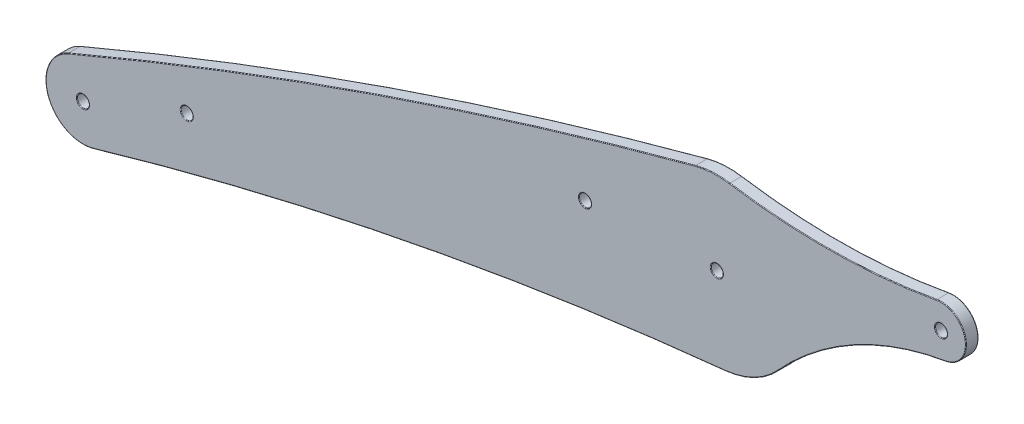
ISO-10303-21;
HEADER;
FILE_DESCRIPTION(('STEP AP214'),'2;1');
FILE_NAME('part.step','',(''),(''),'','','');
FILE_SCHEMA(('AUTOMOTIVE_DESIGN { 1 0 10303 214 1 1 1 1 }'));
ENDSEC;
DATA;
#1=APPLICATION_CONTEXT('core data for automotive mechanical design processes');
#2=APPLICATION_PROTOCOL_DEFINITION('international standard','automotive_design',2000,#1);
#3=PRODUCT_CONTEXT('',#1,'mechanical');
#4=PRODUCT('Part','Part','',(#3));
#5=PRODUCT_RELATED_PRODUCT_CATEGORY('part','',(#4));
#6=PRODUCT_DEFINITION_FORMATION('','',#4);
#7=PRODUCT_DEFINITION_CONTEXT('part definition',#1,'design');
#8=PRODUCT_DEFINITION('design','',#6,#7);
#9=PRODUCT_DEFINITION_SHAPE('','',#8);
#10=(LENGTH_UNIT() NAMED_UNIT(*) SI_UNIT(.MILLI.,.METRE.));
#11=(NAMED_UNIT(*) PLANE_ANGLE_UNIT() SI_UNIT($,.RADIAN.));
#12=(NAMED_UNIT(*) SI_UNIT($,.STERADIAN.) SOLID_ANGLE_UNIT());
#13=UNCERTAINTY_MEASURE_WITH_UNIT(LENGTH_MEASURE(1.E-05),#10,'distance_accuracy_value','');
#14=(GEOMETRIC_REPRESENTATION_CONTEXT(3) GLOBAL_UNCERTAINTY_ASSIGNED_CONTEXT((#13)) GLOBAL_UNIT_ASSIGNED_CONTEXT((#10,
#11,#12)) REPRESENTATION_CONTEXT('',''));
#15=CARTESIAN_POINT('',(0.,0.,0.));
#16=DIRECTION('',(0.,0.,1.));
#17=DIRECTION('',(1.,0.,0.));
#18=AXIS2_PLACEMENT_3D('',#15,#16,#17);
#19=CARTESIAN_POINT('',(-219.896078152354,156.899093699463,-3.));
#20=DIRECTION('',(0.,0.,1.));
#21=DIRECTION('',(1.,0.,0.));
#22=AXIS2_PLACEMENT_3D('',#19,#20,#21);
#23=CYLINDRICAL_SURFACE('',#22,9.00000000000002);
#24=DIRECTION('',(0.,0.,1.));
#25=VECTOR('',#24,1.);
#26=CARTESIAN_POINT('',(-223.412781063137,165.183585273319,-3.));
#27=LINE('',#26,#25);
#28=CARTESIAN_POINT('',(-223.412781063137,165.183585273319,-2.85));
#29=VERTEX_POINT('',#28);
#30=CARTESIAN_POINT('',(-223.412781063137,165.183585273319,-0.15));
#31=VERTEX_POINT('',#30);
#32=EDGE_CURVE('E152',#29,#31,#27,.T.);
#33=ORIENTED_EDGE('',*,*,#32,.F.);
#34=CARTESIAN_POINT('',(-219.896078152354,156.899093699463,-2.85));
#35=DIRECTION('',(0.,0.,1.));
#36=DIRECTION('',(1.,0.,0.));
#37=AXIS2_PLACEMENT_3D('',#34,#35,#36);
#38=CIRCLE('',#37,9.00000000000002);
#39=CARTESIAN_POINT('',(-217.370309700042,148.26077825458,-2.85));
#40=VERTEX_POINT('',#39);
#41=EDGE_CURVE('E147',#29,#40,#38,.T.);
#42=ORIENTED_EDGE('',*,*,#41,.T.);
#43=DIRECTION('',(0.,0.,1.));
#44=VECTOR('',#43,1.);
#45=CARTESIAN_POINT('',(-217.370309700042,148.26077825458,-3.));
#46=LINE('',#45,#44);
#47=CARTESIAN_POINT('',(-217.370309700042,148.26077825458,-0.15));
#48=VERTEX_POINT('',#47);
#49=EDGE_CURVE('E149',#40,#48,#46,.T.);
#50=ORIENTED_EDGE('',*,*,#49,.T.);
#51=CARTESIAN_POINT('',(-219.896078152354,156.899093699463,-0.15));
#52=DIRECTION('',(0.,0.,1.));
#53=DIRECTION('',(1.,0.,0.));
#54=AXIS2_PLACEMENT_3D('',#51,#52,#53);
#55=CIRCLE('',#54,9.00000000000002);
#56=EDGE_CURVE('E158',#48,#31,#55,.F.);
#57=ORIENTED_EDGE('',*,*,#56,.T.);
#58=EDGE_LOOP('',(#33,#42,#50,#57));
#59=FACE_BOUND('',#58,.T.);
#60=ADVANCED_FACE('F33',(#59),#23,.T.);
#61=CARTESIAN_POINT('',(225.943701981326,-893.390338052734,-3.));
#62=DIRECTION('',(0.,0.,1.));
#63=DIRECTION('',(1.,0.,0.));
#64=AXIS2_PLACEMENT_3D('',#61,#62,#63);
#65=CYLINDRICAL_SURFACE('',#64,1150.);
#66=DIRECTION('',(0.,0.,1.));
#67=VECTOR('',#66,1.);
#68=CARTESIAN_POINT('',(-72.4140554222163,217.232301999741,-3.));
#69=LINE('',#68,#67);
#70=CARTESIAN_POINT('',(-72.4140554222163,217.232301999741,-2.85));
#71=VERTEX_POINT('',#70);
#72=CARTESIAN_POINT('',(-72.4140554222163,217.232301999741,-0.15));
#73=VERTEX_POINT('',#72);
#74=EDGE_CURVE('E369',#71,#73,#69,.T.);
#75=ORIENTED_EDGE('',*,*,#74,.F.);
#76=CARTESIAN_POINT('',(225.943701981326,-893.390338052734,-2.85));
#77=DIRECTION('',(0.,0.,1.));
#78=DIRECTION('',(1.,0.,0.));
#79=AXIS2_PLACEMENT_3D('',#76,#77,#78);
#80=CIRCLE('',#79,1150.);
#81=EDGE_CURVE('E241',#71,#29,#80,.T.);
#82=ORIENTED_EDGE('',*,*,#81,.T.);
#83=ORIENTED_EDGE('',*,*,#32,.T.);
#84=CARTESIAN_POINT('',(225.943701981326,-893.390338052734,-0.15));
#85=DIRECTION('',(0.,0.,1.));
#86=DIRECTION('',(1.,0.,0.));
#87=AXIS2_PLACEMENT_3D('',#84,#85,#86);
#88=CIRCLE('',#87,1150.);
#89=EDGE_CURVE('E238',#31,#73,#88,.F.);
#90=ORIENTED_EDGE('',*,*,#89,.T.);
#91=EDGE_LOOP('',(#75,#82,#83,#90));
#92=FACE_BOUND('',#91,.T.);
#93=ADVANCED_FACE('F375',(#92),#65,.T.);
#94=CARTESIAN_POINT('',(-67.2252248586763,197.917125651003,-3.));
#95=DIRECTION('',(0.,0.,1.));
#96=DIRECTION('',(1.,0.,0.));
#97=AXIS2_PLACEMENT_3D('',#94,#95,#96);
#98=CYLINDRICAL_SURFACE('',#97,20.);
#99=DIRECTION('',(0.,0.,1.));
#100=VECTOR('',#99,1.);
#101=CARTESIAN_POINT('',(-64.1575992638607,217.680467301898,-3.));
#102=LINE('',#101,#100);
#103=CARTESIAN_POINT('',(-64.1575992638607,217.680467301898,-2.85));
#104=VERTEX_POINT('',#103);
#105=CARTESIAN_POINT('',(-64.1575992638607,217.680467301898,-0.15));
#106=VERTEX_POINT('',#105);
#107=EDGE_CURVE('E366',#104,#106,#102,.T.);
#108=ORIENTED_EDGE('',*,*,#107,.F.);
#109=CARTESIAN_POINT('',(-67.2252248586763,197.917125651003,-2.85));
#110=DIRECTION('',(0.,0.,1.));
#111=DIRECTION('',(1.,0.,0.));
#112=AXIS2_PLACEMENT_3D('',#109,#110,#111);
#113=CIRCLE('',#112,20.);
#114=EDGE_CURVE('E236',#104,#71,#113,.T.);
#115=ORIENTED_EDGE('',*,*,#114,.T.);
#116=ORIENTED_EDGE('',*,*,#74,.T.);
#117=CARTESIAN_POINT('',(-67.2252248586763,197.917125651003,-0.15));
#118=DIRECTION('',(0.,0.,1.));
#119=DIRECTION('',(1.,0.,0.));
#120=AXIS2_PLACEMENT_3D('',#117,#118,#119);
#121=CIRCLE('',#120,20.);
#122=EDGE_CURVE('E234',#73,#106,#121,.F.);
#123=ORIENTED_EDGE('',*,*,#122,.T.);
#124=EDGE_LOOP('',(#108,#115,#116,#123));
#125=FACE_BOUND('',#124,.T.);
#126=ADVANCED_FACE('F429',(#125),#98,.T.);
#127=CARTESIAN_POINT('',(-41.1504073027438,365.905529683617,-3.));
#128=DIRECTION('',(0.,0.,1.));
#129=DIRECTION('',(1.,0.,0.));
#130=AXIS2_PLACEMENT_3D('',#127,#128,#129);
#131=CYLINDRICAL_SURFACE('',#130,150.);
#132=DIRECTION('',(0.,0.,1.));
#133=VECTOR('',#132,1.);
#134=CARTESIAN_POINT('',(-14.2992703372944,218.328375477206,-3.));
#135=LINE('',#134,#133);
#136=CARTESIAN_POINT('',(-14.2992703372944,218.328375477206,-2.85));
#137=VERTEX_POINT('',#136);
#138=CARTESIAN_POINT('',(-14.2992703372944,218.328375477206,-0.15));
#139=VERTEX_POINT('',#138);
#140=EDGE_CURVE('E360',#137,#139,#135,.T.);
#141=ORIENTED_EDGE('',*,*,#140,.F.);
#142=CARTESIAN_POINT('',(-41.1504073027438,365.905529683617,-2.85));
#143=DIRECTION('',(0.,0.,1.));
#144=DIRECTION('',(1.,0.,0.));
#145=AXIS2_PLACEMENT_3D('',#142,#143,#144);
#146=CIRCLE('',#145,150.);
#147=EDGE_CURVE('E232',#137,#104,#146,.F.);
#148=ORIENTED_EDGE('',*,*,#147,.T.);
#149=ORIENTED_EDGE('',*,*,#107,.T.);
#150=CARTESIAN_POINT('',(-41.1504073027438,365.905529683617,-0.15));
#151=DIRECTION('',(0.,0.,1.));
#152=DIRECTION('',(1.,0.,0.));
#153=AXIS2_PLACEMENT_3D('',#150,#151,#152);
#154=CIRCLE('',#153,150.);
#155=EDGE_CURVE('E230',#106,#139,#154,.T.);
#156=ORIENTED_EDGE('',*,*,#155,.T.);
#157=EDGE_LOOP('',(#141,#148,#149,#156));
#158=FACE_BOUND('',#157,.T.);
#159=ADVANCED_FACE('F722',(#158),#131,.F.);
#160=CARTESIAN_POINT('',(-13.2252248586763,212.42528930895,-3.));
#161=DIRECTION('',(0.,0.,1.));
#162=DIRECTION('',(1.,0.,0.));
#163=AXIS2_PLACEMENT_3D('',#160,#161,#162);
#164=CYLINDRICAL_SURFACE('',#163,6.00000000000003);
#165=DIRECTION('',(0.,0.,1.));
#166=VECTOR('',#165,1.);
#167=CARTESIAN_POINT('',(-12.2224909899665,206.509672283775,-3.));
#168=LINE('',#167,#166);
#169=CARTESIAN_POINT('',(-12.2224909899665,206.509672283775,-2.85));
#170=VERTEX_POINT('',#169);
#171=CARTESIAN_POINT('',(-12.2224909899665,206.509672283775,-0.15));
#172=VERTEX_POINT('',#171);
#173=EDGE_CURVE('E356',#170,#172,#168,.T.);
#174=ORIENTED_EDGE('',*,*,#173,.F.);
#175=CARTESIAN_POINT('',(-13.2252248586763,212.42528930895,-2.85));
#176=DIRECTION('',(0.,0.,1.));
#177=DIRECTION('',(1.,0.,0.));
#178=AXIS2_PLACEMENT_3D('',#175,#176,#177);
#179=CIRCLE('',#178,6.00000000000003);
#180=EDGE_CURVE('E228',#170,#137,#179,.T.);
#181=ORIENTED_EDGE('',*,*,#180,.T.);
#182=ORIENTED_EDGE('',*,*,#140,.T.);
#183=CARTESIAN_POINT('',(-13.2252248586763,212.42528930895,-0.15));
#184=DIRECTION('',(0.,0.,1.));
#185=DIRECTION('',(1.,0.,0.));
#186=AXIS2_PLACEMENT_3D('',#183,#184,#185);
#187=CIRCLE('',#186,6.00000000000003);
#188=EDGE_CURVE('E226',#139,#172,#187,.F.);
#189=ORIENTED_EDGE('',*,*,#188,.T.);
#190=EDGE_LOOP('',(#174,#181,#182,#189));
#191=FACE_BOUND('',#190,.T.);
#192=ADVANCED_FACE('F714',(#191),#164,.T.);
#193=CARTESIAN_POINT('',(-0.523929188351785,137.494140323398,-3.));
#194=DIRECTION('',(0.,0.,1.));
#195=DIRECTION('',(1.,0.,0.));
#196=AXIS2_PLACEMENT_3D('',#193,#194,#195);
#197=CYLINDRICAL_SURFACE('',#196,70.);
#198=DIRECTION('',(0.,0.,1.));
#199=VECTOR('',#198,1.);
#200=CARTESIAN_POINT('',(-52.4027147097153,184.489795578201,-3.));
#201=LINE('',#200,#199);
#202=CARTESIAN_POINT('',(-52.4027147097153,184.489795578201,-2.85));
#203=VERTEX_POINT('',#202);
#204=CARTESIAN_POINT('',(-52.4027147097153,184.489795578201,-0.15));
#205=VERTEX_POINT('',#204);
#206=EDGE_CURVE('E353',#203,#205,#201,.T.);
#207=ORIENTED_EDGE('',*,*,#206,.F.);
#208=CARTESIAN_POINT('',(-0.523929188351785,137.494140323398,-2.85));
#209=DIRECTION('',(0.,0.,1.));
#210=DIRECTION('',(1.,0.,0.));
#211=AXIS2_PLACEMENT_3D('',#208,#209,#210);
#212=CIRCLE('',#211,70.);
#213=EDGE_CURVE('E224',#203,#170,#212,.F.);
#214=ORIENTED_EDGE('',*,*,#213,.T.);
#215=ORIENTED_EDGE('',*,*,#173,.T.);
#216=CARTESIAN_POINT('',(-0.523929188351785,137.494140323398,-0.15));
#217=DIRECTION('',(0.,0.,1.));
#218=DIRECTION('',(1.,0.,0.));
#219=AXIS2_PLACEMENT_3D('',#216,#217,#218);
#220=CIRCLE('',#219,70.);
#221=EDGE_CURVE('E222',#172,#205,#220,.T.);
#222=ORIENTED_EDGE('',*,*,#221,.T.);
#223=EDGE_LOOP('',(#207,#214,#215,#222));
#224=FACE_BOUND('',#223,.T.);
#225=ADVANCED_FACE('F352',(#224),#197,.F.);
#226=CARTESIAN_POINT('',(-67.2252248586763,197.917125651003,-3.));
#227=DIRECTION('',(0.,0.,1.));
#228=DIRECTION('',(1.,0.,0.));
#229=AXIS2_PLACEMENT_3D('',#226,#227,#228);
#230=CYLINDRICAL_SURFACE('',#229,20.);
#231=DIRECTION('',(0.,0.,1.));
#232=VECTOR('',#231,1.);
#233=CARTESIAN_POINT('',(-65.1930475383863,178.020637133204,-3.));
#234=LINE('',#233,#232);
#235=CARTESIAN_POINT('',(-65.1930475383863,178.020637133204,-2.85));
#236=VERTEX_POINT('',#235);
#237=CARTESIAN_POINT('',(-65.1930475383863,178.020637133204,-0.15));
#238=VERTEX_POINT('',#237);
#239=EDGE_CURVE('E169',#236,#238,#234,.T.);
#240=ORIENTED_EDGE('',*,*,#239,.F.);
#241=CARTESIAN_POINT('',(-67.2252248586763,197.917125651003,-2.85));
#242=DIRECTION('',(0.,0.,1.));
#243=DIRECTION('',(1.,0.,0.));
#244=AXIS2_PLACEMENT_3D('',#241,#242,#243);
#245=CIRCLE('',#244,20.);
#246=EDGE_CURVE('E220',#236,#203,#245,.T.);
#247=ORIENTED_EDGE('',*,*,#246,.T.);
#248=ORIENTED_EDGE('',*,*,#206,.T.);
#249=CARTESIAN_POINT('',(-67.2252248586763,197.917125651003,-0.15));
#250=DIRECTION('',(0.,0.,1.));
#251=DIRECTION('',(1.,0.,0.));
#252=AXIS2_PLACEMENT_3D('',#249,#250,#251);
#253=CIRCLE('',#252,20.);
#254=EDGE_CURVE('E218',#205,#238,#253,.F.);
#255=ORIENTED_EDGE('',*,*,#254,.T.);
#256=EDGE_LOOP('',(#240,#247,#248,#255));
#257=FACE_BOUND('',#256,.T.);
#258=ADVANCED_FACE('F358',(#257),#230,.T.);
#259=CARTESIAN_POINT('',(21.1744885739426,-667.580124873244,-3.));
#260=DIRECTION('',(0.,0.,1.));
#261=DIRECTION('',(1.,0.,0.));
#262=AXIS2_PLACEMENT_3D('',#259,#260,#261);
#263=CYLINDRICAL_SURFACE('',#262,850.);
#264=ORIENTED_EDGE('',*,*,#49,.F.);
#265=CARTESIAN_POINT('',(21.1744885739426,-667.580124873244,-2.85));
#266=DIRECTION('',(0.,0.,1.));
#267=DIRECTION('',(1.,0.,0.));
#268=AXIS2_PLACEMENT_3D('',#265,#266,#267);
#269=CIRCLE('',#268,850.);
#270=EDGE_CURVE('E165',#40,#236,#269,.F.);
#271=ORIENTED_EDGE('',*,*,#270,.T.);
#272=ORIENTED_EDGE('',*,*,#239,.T.);
#273=CARTESIAN_POINT('',(21.1744885739426,-667.580124873244,-0.15));
#274=DIRECTION('',(0.,0.,1.));
#275=DIRECTION('',(1.,0.,0.));
#276=AXIS2_PLACEMENT_3D('',#273,#274,#275);
#277=CIRCLE('',#276,850.);
#278=EDGE_CURVE('E168',#238,#48,#277,.T.);
#279=ORIENTED_EDGE('',*,*,#278,.T.);
#280=EDGE_LOOP('',(#264,#271,#272,#279));
#281=FACE_BOUND('',#280,.T.);
#282=ADVANCED_FACE('F162',(#281),#263,.F.);
#283=CARTESIAN_POINT('',(-99.3607947892059,-255.340515586891,-3.));
#284=DIRECTION('',(0.,0.,1.));
#285=DIRECTION('',(1.,0.,0.));
#286=AXIS2_PLACEMENT_3D('',#283,#284,#285);
#287=PLANE('',#286);
#288=CARTESIAN_POINT('',(-67.2252248586763,197.917125651003,-3.));
#289=DIRECTION('',(0.,0.,1.));
#290=DIRECTION('',(1.,0.,0.));
#291=AXIS2_PLACEMENT_3D('',#288,#289,#290);
#292=CIRCLE('',#291,19.85);
#293=CARTESIAN_POINT('',(-52.5138835358325,184.590500553747,-3.));
#294=VERTEX_POINT('',#293);
#295=CARTESIAN_POINT('',(-65.2082888682884,178.169860797087,-3.));
#296=VERTEX_POINT('',#295);
#297=EDGE_CURVE('E214',#294,#296,#292,.F.);
#298=ORIENTED_EDGE('',*,*,#297,.T.);
#299=CARTESIAN_POINT('',(21.1744885739426,-667.580124873244,-3.));
#300=DIRECTION('',(0.,0.,1.));
#301=DIRECTION('',(1.,0.,0.));
#302=AXIS2_PLACEMENT_3D('',#299,#300,#301);
#303=CIRCLE('',#302,850.15);
#304=CARTESIAN_POINT('',(-217.412405840913,148.404750178662,-3.));
#305=VERTEX_POINT('',#304);
#306=EDGE_CURVE('E216',#296,#305,#303,.T.);
#307=ORIENTED_EDGE('',*,*,#306,.T.);
#308=CARTESIAN_POINT('',(-219.896078152354,156.899093699463,-3.));
#309=DIRECTION('',(0.,0.,1.));
#310=DIRECTION('',(1.,0.,0.));
#311=AXIS2_PLACEMENT_3D('',#308,#309,#310);
#312=CIRCLE('',#311,8.85000000000002);
#313=CARTESIAN_POINT('',(-223.354169347957,165.045510413755,-3.));
#314=VERTEX_POINT('',#313);
#315=EDGE_CURVE('E175',#305,#314,#312,.F.);
#316=ORIENTED_EDGE('',*,*,#315,.T.);
#317=CARTESIAN_POINT('',(225.943701981326,-893.390338052734,-3.));
#318=DIRECTION('',(0.,0.,1.));
#319=DIRECTION('',(1.,0.,0.));
#320=AXIS2_PLACEMENT_3D('',#317,#318,#319);
#321=CIRCLE('',#320,1149.85);
#322=CARTESIAN_POINT('',(-72.3751391929897,217.087438177126,-3.));
#323=VERTEX_POINT('',#322);
#324=EDGE_CURVE('E204',#314,#323,#321,.F.);
#325=ORIENTED_EDGE('',*,*,#324,.T.);
#326=CARTESIAN_POINT('',(-67.2252248586763,197.917125651003,-3.));
#327=DIRECTION('',(0.,0.,1.));
#328=DIRECTION('',(1.,0.,0.));
#329=AXIS2_PLACEMENT_3D('',#326,#327,#328);
#330=CIRCLE('',#329,19.85);
#331=CARTESIAN_POINT('',(-64.1806064558219,217.532242239517,-3.));
#332=VERTEX_POINT('',#331);
#333=EDGE_CURVE('E206',#323,#332,#330,.F.);
#334=ORIENTED_EDGE('',*,*,#333,.T.);
#335=CARTESIAN_POINT('',(-41.1504073027438,365.905529683617,-3.));
#336=DIRECTION('',(0.,0.,1.));
#337=DIRECTION('',(1.,0.,0.));
#338=AXIS2_PLACEMENT_3D('',#335,#336,#337);
#339=CIRCLE('',#338,150.15);
#340=CARTESIAN_POINT('',(-14.2724192003289,218.180798323,-3.));
#341=VERTEX_POINT('',#340);
#342=EDGE_CURVE('E208',#332,#341,#339,.T.);
#343=ORIENTED_EDGE('',*,*,#342,.T.);
#344=CARTESIAN_POINT('',(-13.2252248586763,212.42528930895,-3.));
#345=DIRECTION('',(0.,0.,1.));
#346=DIRECTION('',(1.,0.,0.));
#347=AXIS2_PLACEMENT_3D('',#344,#345,#346);
#348=CIRCLE('',#347,5.85000000000003);
#349=CARTESIAN_POINT('',(-12.2475593366842,206.657562709404,-3.));
#350=VERTEX_POINT('',#349);
#351=EDGE_CURVE('E210',#341,#350,#348,.F.);
#352=ORIENTED_EDGE('',*,*,#351,.T.);
#353=CARTESIAN_POINT('',(-0.523929188351785,137.494140323398,-3.));
#354=DIRECTION('',(0.,0.,1.));
#355=DIRECTION('',(1.,0.,0.));
#356=AXIS2_PLACEMENT_3D('',#353,#354,#355);
#357=CIRCLE('',#356,70.15);
#358=EDGE_CURVE('E212',#350,#294,#357,.T.);
#359=ORIENTED_EDGE('',*,*,#358,.T.);
#360=EDGE_LOOP('',(#298,#307,#316,#325,#334,#343,#352,#359));
#361=FACE_BOUND('',#360,.T.);
#362=CARTESIAN_POINT('',(-13.2252248586763,212.42528930895,-3.));
#363=DIRECTION('',(0.,0.,1.));
#364=DIRECTION('',(1.,0.,0.));
#365=AXIS2_PLACEMENT_3D('',#362,#363,#364);
#366=CIRCLE('',#365,1.59999999999999);
#367=CARTESIAN_POINT('',(-11.6252248586763,212.42528930895,-3.));
#368=VERTEX_POINT('',#367);
#369=EDGE_CURVE('E200',#368,#368,#366,.T.);
#370=ORIENTED_EDGE('',*,*,#369,.T.);
#371=EDGE_LOOP('',(#370));
#372=FACE_BOUND('',#371,.T.);
#373=CARTESIAN_POINT('',(-67.2252248586763,197.917125651003,-3.));
#374=DIRECTION('',(0.,0.,1.));
#375=DIRECTION('',(1.,0.,0.));
#376=AXIS2_PLACEMENT_3D('',#373,#374,#375);
#377=CIRCLE('',#376,1.59999999999999);
#378=CARTESIAN_POINT('',(-65.6252248586763,197.917125651003,-3.));
#379=VERTEX_POINT('',#378);
#380=EDGE_CURVE('E197',#379,#379,#377,.T.);
#381=ORIENTED_EDGE('',*,*,#380,.T.);
#382=EDGE_LOOP('',(#381));
#383=FACE_BOUND('',#382,.T.);
#384=CARTESIAN_POINT('',(-98.9752248586763,196.66005329545,-3.));
#385=DIRECTION('',(0.,0.,1.));
#386=DIRECTION('',(1.,0.,0.));
#387=AXIS2_PLACEMENT_3D('',#384,#385,#386);
#388=CIRCLE('',#387,1.59999999999999);
#389=CARTESIAN_POINT('',(-97.3752248586763,196.66005329545,-3.));
#390=VERTEX_POINT('',#389);
#391=EDGE_CURVE('E194',#390,#390,#388,.T.);
#392=ORIENTED_EDGE('',*,*,#391,.T.);
#393=EDGE_LOOP('',(#392));
#394=FACE_BOUND('',#393,.T.);
#395=CARTESIAN_POINT('',(-194.896078152354,166.921661008845,-3.));
#396=DIRECTION('',(0.,0.,1.));
#397=DIRECTION('',(1.,0.,0.));
#398=AXIS2_PLACEMENT_3D('',#395,#396,#397);
#399=CIRCLE('',#398,1.59999999999998);
#400=CARTESIAN_POINT('',(-193.296078152354,166.921661008845,-3.));
#401=VERTEX_POINT('',#400);
#402=EDGE_CURVE('E188',#401,#401,#399,.T.);
#403=ORIENTED_EDGE('',*,*,#402,.T.);
#404=EDGE_LOOP('',(#403));
#405=FACE_BOUND('',#404,.T.);
#406=CARTESIAN_POINT('',(-219.896078152354,156.899093699463,-3.));
#407=DIRECTION('',(0.,0.,1.));
#408=DIRECTION('',(1.,0.,0.));
#409=AXIS2_PLACEMENT_3D('',#406,#407,#408);
#410=CIRCLE('',#409,1.59999999999998);
#411=CARTESIAN_POINT('',(-218.296078152354,156.899093699463,-3.));
#412=VERTEX_POINT('',#411);
#413=EDGE_CURVE('E185',#412,#412,#410,.T.);
#414=ORIENTED_EDGE('',*,*,#413,.T.);
#415=EDGE_LOOP('',(#414));
#416=FACE_BOUND('',#415,.T.);
#417=ADVANCED_FACE('F391',(#361,#372,#383,#394,#405,#416),#287,.F.);
#418=CARTESIAN_POINT('',(-99.3607947892059,-255.340515586891,0.));
#419=DIRECTION('',(0.,0.,1.));
#420=DIRECTION('',(1.,0.,0.));
#421=AXIS2_PLACEMENT_3D('',#418,#419,#420);
#422=PLANE('',#421);
#423=CARTESIAN_POINT('',(-67.2252248586763,197.917125651003,0.));
#424=DIRECTION('',(0.,0.,1.));
#425=DIRECTION('',(1.,0.,0.));
#426=AXIS2_PLACEMENT_3D('',#423,#424,#425);
#427=CIRCLE('',#426,19.85);
#428=CARTESIAN_POINT('',(-64.1806064558219,217.532242239517,0.));
#429=VERTEX_POINT('',#428);
#430=CARTESIAN_POINT('',(-72.3751391929897,217.087438177126,0.));
#431=VERTEX_POINT('',#430);
#432=EDGE_CURVE('E42',#429,#431,#427,.T.);
#433=ORIENTED_EDGE('',*,*,#432,.T.);
#434=CARTESIAN_POINT('',(225.943701981326,-893.390338052734,0.));
#435=DIRECTION('',(0.,0.,1.));
#436=DIRECTION('',(1.,0.,0.));
#437=AXIS2_PLACEMENT_3D('',#434,#435,#436);
#438=CIRCLE('',#437,1149.85);
#439=CARTESIAN_POINT('',(-223.354169347957,165.045510413755,0.));
#440=VERTEX_POINT('',#439);
#441=EDGE_CURVE('E11',#431,#440,#438,.T.);
#442=ORIENTED_EDGE('',*,*,#441,.T.);
#443=CARTESIAN_POINT('',(-219.896078152354,156.899093699463,0.));
#444=DIRECTION('',(0.,0.,1.));
#445=DIRECTION('',(1.,0.,0.));
#446=AXIS2_PLACEMENT_3D('',#443,#444,#445);
#447=CIRCLE('',#446,8.85000000000002);
#448=CARTESIAN_POINT('',(-217.412405840913,148.404750178662,0.));
#449=VERTEX_POINT('',#448);
#450=EDGE_CURVE('E288',#440,#449,#447,.T.);
#451=ORIENTED_EDGE('',*,*,#450,.T.);
#452=CARTESIAN_POINT('',(21.1744885739426,-667.580124873244,0.));
#453=DIRECTION('',(0.,0.,1.));
#454=DIRECTION('',(1.,0.,0.));
#455=AXIS2_PLACEMENT_3D('',#452,#453,#454);
#456=CIRCLE('',#455,850.15);
#457=CARTESIAN_POINT('',(-65.2082888682884,178.169860797087,0.));
#458=VERTEX_POINT('',#457);
#459=EDGE_CURVE('E290',#449,#458,#456,.F.);
#460=ORIENTED_EDGE('',*,*,#459,.T.);
#461=CARTESIAN_POINT('',(-67.2252248586763,197.917125651003,0.));
#462=DIRECTION('',(0.,0.,1.));
#463=DIRECTION('',(1.,0.,0.));
#464=AXIS2_PLACEMENT_3D('',#461,#462,#463);
#465=CIRCLE('',#464,19.85);
#466=CARTESIAN_POINT('',(-52.5138835358325,184.590500553747,0.));
#467=VERTEX_POINT('',#466);
#468=EDGE_CURVE('E292',#458,#467,#465,.T.);
#469=ORIENTED_EDGE('',*,*,#468,.T.);
#470=CARTESIAN_POINT('',(-0.523929188351785,137.494140323398,0.));
#471=DIRECTION('',(0.,0.,1.));
#472=DIRECTION('',(1.,0.,0.));
#473=AXIS2_PLACEMENT_3D('',#470,#471,#472);
#474=CIRCLE('',#473,70.15);
#475=CARTESIAN_POINT('',(-12.2475593366842,206.657562709404,0.));
#476=VERTEX_POINT('',#475);
#477=EDGE_CURVE('E294',#467,#476,#474,.F.);
#478=ORIENTED_EDGE('',*,*,#477,.T.);
#479=CARTESIAN_POINT('',(-13.2252248586763,212.42528930895,0.));
#480=DIRECTION('',(0.,0.,1.));
#481=DIRECTION('',(1.,0.,0.));
#482=AXIS2_PLACEMENT_3D('',#479,#480,#481);
#483=CIRCLE('',#482,5.85000000000003);
#484=CARTESIAN_POINT('',(-14.2724192003289,218.180798323,0.));
#485=VERTEX_POINT('',#484);
#486=EDGE_CURVE('E296',#476,#485,#483,.T.);
#487=ORIENTED_EDGE('',*,*,#486,.T.);
#488=CARTESIAN_POINT('',(-41.1504073027438,365.905529683617,0.));
#489=DIRECTION('',(0.,0.,1.));
#490=DIRECTION('',(1.,0.,0.));
#491=AXIS2_PLACEMENT_3D('',#488,#489,#490);
#492=CIRCLE('',#491,150.15);
#493=EDGE_CURVE('E53',#485,#429,#492,.F.);
#494=ORIENTED_EDGE('',*,*,#493,.T.);
#495=EDGE_LOOP('',(#433,#442,#451,#460,#469,#478,#487,#494));
#496=FACE_BOUND('',#495,.T.);
#497=CARTESIAN_POINT('',(-13.2252248586763,212.42528930895,0.));
#498=DIRECTION('',(0.,0.,1.));
#499=DIRECTION('',(1.,0.,0.));
#500=AXIS2_PLACEMENT_3D('',#497,#498,#499);
#501=CIRCLE('',#500,1.59999999999999);
#502=CARTESIAN_POINT('',(-11.6252248586763,212.42528930895,0.));
#503=VERTEX_POINT('',#502);
#504=EDGE_CURVE('E285',#503,#503,#501,.F.);
#505=ORIENTED_EDGE('',*,*,#504,.T.);
#506=EDGE_LOOP('',(#505));
#507=FACE_BOUND('',#506,.T.);
#508=CARTESIAN_POINT('',(-67.2252248586763,197.917125651003,0.));
#509=DIRECTION('',(0.,0.,1.));
#510=DIRECTION('',(1.,0.,0.));
#511=AXIS2_PLACEMENT_3D('',#508,#509,#510);
#512=CIRCLE('',#511,1.59999999999999);
#513=CARTESIAN_POINT('',(-65.6252248586763,197.917125651003,0.));
#514=VERTEX_POINT('',#513);
#515=EDGE_CURVE('E282',#514,#514,#512,.F.);
#516=ORIENTED_EDGE('',*,*,#515,.T.);
#517=EDGE_LOOP('',(#516));
#518=FACE_BOUND('',#517,.T.);
#519=CARTESIAN_POINT('',(-98.9752248586763,196.66005329545,0.));
#520=DIRECTION('',(0.,0.,1.));
#521=DIRECTION('',(1.,0.,0.));
#522=AXIS2_PLACEMENT_3D('',#519,#520,#521);
#523=CIRCLE('',#522,1.59999999999999);
#524=CARTESIAN_POINT('',(-97.3752248586763,196.66005329545,0.));
#525=VERTEX_POINT('',#524);
#526=EDGE_CURVE('E279',#525,#525,#523,.F.);
#527=ORIENTED_EDGE('',*,*,#526,.T.);
#528=EDGE_LOOP('',(#527));
#529=FACE_BOUND('',#528,.T.);
#530=CARTESIAN_POINT('',(-194.896078152354,166.921661008845,0.));
#531=DIRECTION('',(0.,0.,1.));
#532=DIRECTION('',(1.,0.,0.));
#533=AXIS2_PLACEMENT_3D('',#530,#531,#532);
#534=CIRCLE('',#533,1.59999999999998);
#535=CARTESIAN_POINT('',(-193.296078152354,166.921661008845,0.));
#536=VERTEX_POINT('',#535);
#537=EDGE_CURVE('E276',#536,#536,#534,.F.);
#538=ORIENTED_EDGE('',*,*,#537,.T.);
#539=EDGE_LOOP('',(#538));
#540=FACE_BOUND('',#539,.T.);
#541=CARTESIAN_POINT('',(-219.896078152354,156.899093699463,0.));
#542=DIRECTION('',(0.,0.,1.));
#543=DIRECTION('',(1.,0.,0.));
#544=AXIS2_PLACEMENT_3D('',#541,#542,#543);
#545=CIRCLE('',#544,1.59999999999998);
#546=CARTESIAN_POINT('',(-218.296078152354,156.899093699463,0.));
#547=VERTEX_POINT('',#546);
#548=EDGE_CURVE('E273',#547,#547,#545,.F.);
#549=ORIENTED_EDGE('',*,*,#548,.T.);
#550=EDGE_LOOP('',(#549));
#551=FACE_BOUND('',#550,.T.);
#552=ADVANCED_FACE('F387',(#496,#507,#518,#529,#540,#551),#422,.T.);
#553=CARTESIAN_POINT('',(-13.2252248586763,212.42528930895,0.));
#554=DIRECTION('',(0.,0.,1.));
#555=DIRECTION('',(1.,0.,0.));
#556=AXIS2_PLACEMENT_3D('',#553,#554,#555);
#557=CYLINDRICAL_SURFACE('',#556,1.44999999999999);
#558=CARTESIAN_POINT('',(-13.2252248586763,212.42528930895,-2.85));
#559=DIRECTION('',(0.,0.,1.));
#560=DIRECTION('',(1.,0.,0.));
#561=AXIS2_PLACEMENT_3D('',#558,#559,#560);
#562=CIRCLE('',#561,1.44999999999999);
#563=CARTESIAN_POINT('',(-11.7752248586763,212.42528930895,-2.85));
#564=VERTEX_POINT('',#563);
#565=EDGE_CURVE('E246',#564,#564,#562,.F.);
#566=ORIENTED_EDGE('',*,*,#565,.T.);
#567=EDGE_LOOP('',(#566));
#568=FACE_BOUND('',#567,.T.);
#569=CARTESIAN_POINT('',(-13.2252248586763,212.42528930895,-0.15));
#570=DIRECTION('',(0.,0.,1.));
#571=DIRECTION('',(1.,0.,0.));
#572=AXIS2_PLACEMENT_3D('',#569,#570,#571);
#573=CIRCLE('',#572,1.44999999999999);
#574=CARTESIAN_POINT('',(-11.7752248586763,212.42528930895,-0.15));
#575=VERTEX_POINT('',#574);
#576=EDGE_CURVE('E157',#575,#575,#573,.T.);
#577=ORIENTED_EDGE('',*,*,#576,.T.);
#578=EDGE_LOOP('',(#577));
#579=FACE_BOUND('',#578,.T.);
#580=ADVANCED_FACE('F390',(#568,#579),#557,.F.);
#581=CARTESIAN_POINT('',(-67.2252248586763,197.917125651003,0.));
#582=DIRECTION('',(0.,0.,1.));
#583=DIRECTION('',(1.,0.,0.));
#584=AXIS2_PLACEMENT_3D('',#581,#582,#583);
#585=CYLINDRICAL_SURFACE('',#584,1.44999999999999);
#586=CARTESIAN_POINT('',(-67.2252248586763,197.917125651003,-2.85));
#587=DIRECTION('',(0.,0.,1.));
#588=DIRECTION('',(1.,0.,0.));
#589=AXIS2_PLACEMENT_3D('',#586,#587,#588);
#590=CIRCLE('',#589,1.44999999999999);
#591=CARTESIAN_POINT('',(-65.7752248586763,197.917125651003,-2.85));
#592=VERTEX_POINT('',#591);
#593=EDGE_CURVE('E252',#592,#592,#590,.F.);
#594=ORIENTED_EDGE('',*,*,#593,.T.);
#595=EDGE_LOOP('',(#594));
#596=FACE_BOUND('',#595,.T.);
#597=CARTESIAN_POINT('',(-67.2252248586763,197.917125651003,-0.15));
#598=DIRECTION('',(0.,0.,1.));
#599=DIRECTION('',(1.,0.,0.));
#600=AXIS2_PLACEMENT_3D('',#597,#598,#599);
#601=CIRCLE('',#600,1.44999999999999);
#602=CARTESIAN_POINT('',(-65.7752248586763,197.917125651003,-0.15));
#603=VERTEX_POINT('',#602);
#604=EDGE_CURVE('E249',#603,#603,#601,.T.);
#605=ORIENTED_EDGE('',*,*,#604,.T.);
#606=EDGE_LOOP('',(#605));
#607=FACE_BOUND('',#606,.T.);
#608=ADVANCED_FACE('F664',(#596,#607),#585,.F.);
#609=CARTESIAN_POINT('',(-98.9752248586763,196.66005329545,0.));
#610=DIRECTION('',(0.,0.,1.));
#611=DIRECTION('',(1.,0.,0.));
#612=AXIS2_PLACEMENT_3D('',#609,#610,#611);
#613=CYLINDRICAL_SURFACE('',#612,1.44999999999999);
#614=CARTESIAN_POINT('',(-98.9752248586763,196.66005329545,-2.85));
#615=DIRECTION('',(0.,0.,1.));
#616=DIRECTION('',(1.,0.,0.));
#617=AXIS2_PLACEMENT_3D('',#614,#615,#616);
#618=CIRCLE('',#617,1.44999999999999);
#619=CARTESIAN_POINT('',(-97.5252248586763,196.66005329545,-2.85));
#620=VERTEX_POINT('',#619);
#621=EDGE_CURVE('E258',#620,#620,#618,.F.);
#622=ORIENTED_EDGE('',*,*,#621,.T.);
#623=EDGE_LOOP('',(#622));
#624=FACE_BOUND('',#623,.T.);
#625=CARTESIAN_POINT('',(-98.9752248586763,196.66005329545,-0.15));
#626=DIRECTION('',(0.,0.,1.));
#627=DIRECTION('',(1.,0.,0.));
#628=AXIS2_PLACEMENT_3D('',#625,#626,#627);
#629=CIRCLE('',#628,1.44999999999999);
#630=CARTESIAN_POINT('',(-97.5252248586763,196.66005329545,-0.15));
#631=VERTEX_POINT('',#630);
#632=EDGE_CURVE('E255',#631,#631,#629,.T.);
#633=ORIENTED_EDGE('',*,*,#632,.T.);
#634=EDGE_LOOP('',(#633));
#635=FACE_BOUND('',#634,.T.);
#636=ADVANCED_FACE('F421',(#624,#635),#613,.F.);
#637=CARTESIAN_POINT('',(-194.896078152354,166.921661008845,0.));
#638=DIRECTION('',(0.,0.,1.));
#639=DIRECTION('',(1.,0.,0.));
#640=AXIS2_PLACEMENT_3D('',#637,#638,#639);
#641=CYLINDRICAL_SURFACE('',#640,1.44999999999998);
#642=CARTESIAN_POINT('',(-194.896078152354,166.921661008845,-2.85));
#643=DIRECTION('',(0.,0.,1.));
#644=DIRECTION('',(1.,0.,0.));
#645=AXIS2_PLACEMENT_3D('',#642,#643,#644);
#646=CIRCLE('',#645,1.44999999999998);
#647=CARTESIAN_POINT('',(-193.446078152354,166.921661008845,-2.85));
#648=VERTEX_POINT('',#647);
#649=EDGE_CURVE('E264',#648,#648,#646,.F.);
#650=ORIENTED_EDGE('',*,*,#649,.T.);
#651=EDGE_LOOP('',(#650));
#652=FACE_BOUND('',#651,.T.);
#653=CARTESIAN_POINT('',(-194.896078152354,166.921661008845,-0.15));
#654=DIRECTION('',(0.,0.,1.));
#655=DIRECTION('',(1.,0.,0.));
#656=AXIS2_PLACEMENT_3D('',#653,#654,#655);
#657=CIRCLE('',#656,1.44999999999998);
#658=CARTESIAN_POINT('',(-193.446078152354,166.921661008845,-0.15));
#659=VERTEX_POINT('',#658);
#660=EDGE_CURVE('E261',#659,#659,#657,.T.);
#661=ORIENTED_EDGE('',*,*,#660,.T.);
#662=EDGE_LOOP('',(#661));
#663=FACE_BOUND('',#662,.T.);
#664=ADVANCED_FACE('F411',(#652,#663),#641,.F.);
#665=CARTESIAN_POINT('',(-219.896078152354,156.899093699463,0.));
#666=DIRECTION('',(0.,0.,1.));
#667=DIRECTION('',(1.,0.,0.));
#668=AXIS2_PLACEMENT_3D('',#665,#666,#667);
#669=CYLINDRICAL_SURFACE('',#668,1.44999999999998);
#670=CARTESIAN_POINT('',(-219.896078152354,156.899093699463,-2.85));
#671=DIRECTION('',(0.,0.,1.));
#672=DIRECTION('',(1.,0.,0.));
#673=AXIS2_PLACEMENT_3D('',#670,#671,#672);
#674=CIRCLE('',#673,1.44999999999998);
#675=CARTESIAN_POINT('',(-218.446078152354,156.899093699463,-2.85));
#676=VERTEX_POINT('',#675);
#677=EDGE_CURVE('E270',#676,#676,#674,.F.);
#678=ORIENTED_EDGE('',*,*,#677,.T.);
#679=EDGE_LOOP('',(#678));
#680=FACE_BOUND('',#679,.T.);
#681=CARTESIAN_POINT('',(-219.896078152354,156.899093699463,-0.15));
#682=DIRECTION('',(0.,0.,1.));
#683=DIRECTION('',(1.,0.,0.));
#684=AXIS2_PLACEMENT_3D('',#681,#682,#683);
#685=CIRCLE('',#684,1.44999999999998);
#686=CARTESIAN_POINT('',(-218.446078152354,156.899093699463,-0.15));
#687=VERTEX_POINT('',#686);
#688=EDGE_CURVE('E267',#687,#687,#685,.T.);
#689=ORIENTED_EDGE('',*,*,#688,.T.);
#690=EDGE_LOOP('',(#689));
#691=FACE_BOUND('',#690,.T.);
#692=ADVANCED_FACE('F408',(#680,#691),#669,.F.);
#693=CARTESIAN_POINT('',(-41.1504073027438,365.905529683617,-2.85));
#694=DIRECTION('',(0.,0.,1.));
#695=DIRECTION('',(1.,0.,0.));
#696=AXIS2_PLACEMENT_3D('',#693,#694,#695);
#697=TOROIDAL_SURFACE('',#696,150.15,0.15);
#698=CARTESIAN_POINT('',(-14.2724192003289,218.180798323,-2.85));
#699=DIRECTION('',(0.983847694709401,0.179007579769675,0.));
#700=DIRECTION('',(-0.179007579769675,0.983847694709401,0.));
#701=AXIS2_PLACEMENT_3D('',#698,#699,#700);
#702=CIRCLE('',#701,0.15);
#703=EDGE_CURVE('E311',#341,#137,#702,.T.);
#704=ORIENTED_EDGE('',*,*,#703,.F.);
#705=ORIENTED_EDGE('',*,*,#342,.F.);
#706=CARTESIAN_POINT('',(-64.1806064558219,217.532242239517,-2.85));
#707=DIRECTION('',(-0.988167082544786,0.153381279740799,0.));
#708=DIRECTION('',(-0.153381279740799,-0.988167082544786,0.));
#709=AXIS2_PLACEMENT_3D('',#706,#707,#708);
#710=CIRCLE('',#709,0.15);
#711=EDGE_CURVE('E170',#104,#332,#710,.T.);
#712=ORIENTED_EDGE('',*,*,#711,.F.);
#713=ORIENTED_EDGE('',*,*,#147,.F.);
#714=EDGE_LOOP('',(#704,#705,#712,#713));
#715=FACE_BOUND('',#714,.T.);
#716=ADVANCED_FACE('F410',(#715),#697,.T.);
#717=CARTESIAN_POINT('',(-67.2252248586763,197.917125651003,-2.85));
#718=DIRECTION('',(0.,0.,1.));
#719=DIRECTION('',(1.,0.,0.));
#720=AXIS2_PLACEMENT_3D('',#717,#718,#719);
#721=TOROIDAL_SURFACE('',#720,19.85,0.15);
#722=ORIENTED_EDGE('',*,*,#711,.T.);
#723=ORIENTED_EDGE('',*,*,#333,.F.);
#724=CARTESIAN_POINT('',(-72.3751391929897,217.087438177126,-2.85));
#725=DIRECTION('',(-0.965758817436919,-0.25944152817705,0.));
#726=DIRECTION('',(0.25944152817705,-0.965758817436919,0.));
#727=AXIS2_PLACEMENT_3D('',#724,#725,#726);
#728=CIRCLE('',#727,0.15);
#729=EDGE_CURVE('E308',#71,#323,#728,.T.);
#730=ORIENTED_EDGE('',*,*,#729,.F.);
#731=ORIENTED_EDGE('',*,*,#114,.F.);
#732=EDGE_LOOP('',(#722,#723,#730,#731));
#733=FACE_BOUND('',#732,.T.);
#734=ADVANCED_FACE('F418',(#733),#721,.T.);
#735=CARTESIAN_POINT('',(-13.2252248586763,212.42528930895,-2.85));
#736=DIRECTION('',(0.,0.,1.));
#737=DIRECTION('',(1.,0.,0.));
#738=AXIS2_PLACEMENT_3D('',#735,#736,#737);
#739=TOROIDAL_SURFACE('',#738,5.85000000000003,0.15);
#740=ORIENTED_EDGE('',*,*,#703,.T.);
#741=ORIENTED_EDGE('',*,*,#180,.F.);
#742=CARTESIAN_POINT('',(-12.2475593366842,206.657562709404,-2.85));
#743=DIRECTION('',(-0.985936170862524,-0.167122311451655,0.));
#744=DIRECTION('',(0.167122311451655,-0.985936170862524,0.));
#745=AXIS2_PLACEMENT_3D('',#742,#743,#744);
#746=CIRCLE('',#745,0.15);
#747=EDGE_CURVE('E305',#350,#170,#746,.T.);
#748=ORIENTED_EDGE('',*,*,#747,.F.);
#749=ORIENTED_EDGE('',*,*,#351,.F.);
#750=EDGE_LOOP('',(#740,#741,#748,#749));
#751=FACE_BOUND('',#750,.T.);
#752=ADVANCED_FACE('F450',(#751),#739,.T.);
#753=CARTESIAN_POINT('',(225.943701981326,-893.390338052734,-2.85));
#754=DIRECTION('',(0.,0.,1.));
#755=DIRECTION('',(1.,0.,0.));
#756=AXIS2_PLACEMENT_3D('',#753,#754,#755);
#757=TOROIDAL_SURFACE('',#756,1149.85,0.15);
#758=ORIENTED_EDGE('',*,*,#729,.T.);
#759=ORIENTED_EDGE('',*,*,#324,.F.);
#760=CARTESIAN_POINT('',(-223.354169347957,165.045510413755,-2.85));
#761=DIRECTION('',(-0.920499063761799,-0.390744767864717,0.));
#762=DIRECTION('',(0.390744767864717,-0.920499063761799,0.));
#763=AXIS2_PLACEMENT_3D('',#760,#761,#762);
#764=CIRCLE('',#763,0.15);
#765=EDGE_CURVE('E303',#29,#314,#764,.T.);
#766=ORIENTED_EDGE('',*,*,#765,.F.);
#767=ORIENTED_EDGE('',*,*,#81,.F.);
#768=EDGE_LOOP('',(#758,#759,#766,#767));
#769=FACE_BOUND('',#768,.T.);
#770=ADVANCED_FACE('F446',(#769),#757,.T.);
#771=CARTESIAN_POINT('',(-0.523929188351785,137.494140323398,-2.85));
#772=DIRECTION('',(0.,0.,1.));
#773=DIRECTION('',(1.,0.,0.));
#774=AXIS2_PLACEMENT_3D('',#771,#772,#773);
#775=TOROIDAL_SURFACE('',#774,70.15,0.15);
#776=ORIENTED_EDGE('',*,*,#747,.T.);
#777=ORIENTED_EDGE('',*,*,#213,.F.);
#778=CARTESIAN_POINT('',(-52.5138835358325,184.590500553747,-2.85));
#779=DIRECTION('',(-0.671366503640103,-0.741125507448006,0.));
#780=DIRECTION('',(0.741125507448006,-0.671366503640103,0.));
#781=AXIS2_PLACEMENT_3D('',#778,#779,#780);
#782=CIRCLE('',#781,0.15);
#783=EDGE_CURVE('E179',#294,#203,#782,.T.);
#784=ORIENTED_EDGE('',*,*,#783,.F.);
#785=ORIENTED_EDGE('',*,*,#358,.F.);
#786=EDGE_LOOP('',(#776,#777,#784,#785));
#787=FACE_BOUND('',#786,.T.);
#788=ADVANCED_FACE('F443',(#787),#775,.T.);
#789=CARTESIAN_POINT('',(-219.896078152354,156.899093699463,-2.85));
#790=DIRECTION('',(0.,0.,1.));
#791=DIRECTION('',(1.,0.,0.));
#792=AXIS2_PLACEMENT_3D('',#789,#790,#791);
#793=TOROIDAL_SURFACE('',#792,8.85000000000002,0.15);
#794=ORIENTED_EDGE('',*,*,#765,.T.);
#795=ORIENTED_EDGE('',*,*,#315,.F.);
#796=CARTESIAN_POINT('',(-217.412405840913,148.404750178662,-2.85));
#797=DIRECTION('',(0.959812827209192,0.280640939145909,1.77601050016369E-13));
#798=DIRECTION('',(-0.280640939145909,0.959812827209192,0.));
#799=AXIS2_PLACEMENT_3D('',#796,#797,#798);
#800=CIRCLE('',#799,0.15);
#801=EDGE_CURVE('E173',#40,#305,#800,.T.);
#802=ORIENTED_EDGE('',*,*,#801,.F.);
#803=ORIENTED_EDGE('',*,*,#41,.F.);
#804=EDGE_LOOP('',(#794,#795,#802,#803));
#805=FACE_BOUND('',#804,.T.);
#806=ADVANCED_FACE('F174',(#805),#793,.T.);
#807=CARTESIAN_POINT('',(-67.2252248586763,197.917125651003,-2.85));
#808=DIRECTION('',(0.,0.,1.));
#809=DIRECTION('',(1.,0.,0.));
#810=AXIS2_PLACEMENT_3D('',#807,#808,#809);
#811=TOROIDAL_SURFACE('',#810,19.85,0.15);
#812=ORIENTED_EDGE('',*,*,#783,.T.);
#813=ORIENTED_EDGE('',*,*,#246,.F.);
#814=CARTESIAN_POINT('',(-65.2082888682884,178.169860797087,-2.85));
#815=DIRECTION('',(-0.994824425889939,-0.101608866014502,0.));
#816=DIRECTION('',(0.101608866014502,-0.994824425889939,0.));
#817=AXIS2_PLACEMENT_3D('',#814,#815,#816);
#818=CIRCLE('',#817,0.15);
#819=EDGE_CURVE('E180',#296,#236,#818,.T.);
#820=ORIENTED_EDGE('',*,*,#819,.F.);
#821=ORIENTED_EDGE('',*,*,#297,.F.);
#822=EDGE_LOOP('',(#812,#813,#820,#821));
#823=FACE_BOUND('',#822,.T.);
#824=ADVANCED_FACE('F437',(#823),#811,.T.);
#825=CARTESIAN_POINT('',(21.1744885739426,-667.580124873244,-2.85));
#826=DIRECTION('',(0.,0.,1.));
#827=DIRECTION('',(1.,0.,0.));
#828=AXIS2_PLACEMENT_3D('',#825,#826,#827);
#829=TOROIDAL_SURFACE('',#828,850.15,0.15);
#830=ORIENTED_EDGE('',*,*,#801,.T.);
#831=ORIENTED_EDGE('',*,*,#306,.F.);
#832=ORIENTED_EDGE('',*,*,#819,.T.);
#833=ORIENTED_EDGE('',*,*,#270,.F.);
#834=EDGE_LOOP('',(#830,#831,#832,#833));
#835=FACE_BOUND('',#834,.T.);
#836=ADVANCED_FACE('F182',(#835),#829,.T.);
#837=CARTESIAN_POINT('',(-13.2252248586763,212.42528930895,-2.85));
#838=DIRECTION('',(0.,0.,1.));
#839=DIRECTION('',(1.,0.,0.));
#840=AXIS2_PLACEMENT_3D('',#837,#838,#839);
#841=TOROIDAL_SURFACE('',#840,1.59999999999999,0.15);
#842=ORIENTED_EDGE('',*,*,#565,.F.);
#843=EDGE_LOOP('',(#842));
#844=FACE_BOUND('',#843,.T.);
#845=ORIENTED_EDGE('',*,*,#369,.F.);
#846=EDGE_LOOP('',(#845));
#847=FACE_BOUND('',#846,.T.);
#848=ADVANCED_FACE('F436',(#844,#847),#841,.T.);
#849=CARTESIAN_POINT('',(-67.2252248586763,197.917125651003,-2.85));
#850=DIRECTION('',(0.,0.,1.));
#851=DIRECTION('',(1.,0.,0.));
#852=AXIS2_PLACEMENT_3D('',#849,#850,#851);
#853=TOROIDAL_SURFACE('',#852,1.59999999999999,0.15);
#854=ORIENTED_EDGE('',*,*,#593,.F.);
#855=EDGE_LOOP('',(#854));
#856=FACE_BOUND('',#855,.T.);
#857=ORIENTED_EDGE('',*,*,#380,.F.);
#858=EDGE_LOOP('',(#857));
#859=FACE_BOUND('',#858,.T.);
#860=ADVANCED_FACE('F460',(#856,#859),#853,.T.);
#861=CARTESIAN_POINT('',(-98.9752248586763,196.66005329545,-2.85));
#862=DIRECTION('',(0.,0.,1.));
#863=DIRECTION('',(1.,0.,0.));
#864=AXIS2_PLACEMENT_3D('',#861,#862,#863);
#865=TOROIDAL_SURFACE('',#864,1.59999999999999,0.15);
#866=ORIENTED_EDGE('',*,*,#621,.F.);
#867=EDGE_LOOP('',(#866));
#868=FACE_BOUND('',#867,.T.);
#869=ORIENTED_EDGE('',*,*,#391,.F.);
#870=EDGE_LOOP('',(#869));
#871=FACE_BOUND('',#870,.T.);
#872=ADVANCED_FACE('F464',(#868,#871),#865,.T.);
#873=CARTESIAN_POINT('',(-194.896078152354,166.921661008845,-2.85));
#874=DIRECTION('',(0.,0.,1.));
#875=DIRECTION('',(1.,0.,0.));
#876=AXIS2_PLACEMENT_3D('',#873,#874,#875);
#877=TOROIDAL_SURFACE('',#876,1.59999999999998,0.15);
#878=ORIENTED_EDGE('',*,*,#649,.F.);
#879=EDGE_LOOP('',(#878));
#880=FACE_BOUND('',#879,.T.);
#881=ORIENTED_EDGE('',*,*,#402,.F.);
#882=EDGE_LOOP('',(#881));
#883=FACE_BOUND('',#882,.T.);
#884=ADVANCED_FACE('F468',(#880,#883),#877,.T.);
#885=CARTESIAN_POINT('',(-219.896078152354,156.899093699463,-2.85));
#886=DIRECTION('',(0.,0.,1.));
#887=DIRECTION('',(1.,0.,0.));
#888=AXIS2_PLACEMENT_3D('',#885,#886,#887);
#889=TOROIDAL_SURFACE('',#888,1.59999999999998,0.15);
#890=ORIENTED_EDGE('',*,*,#677,.F.);
#891=EDGE_LOOP('',(#890));
#892=FACE_BOUND('',#891,.T.);
#893=ORIENTED_EDGE('',*,*,#413,.F.);
#894=EDGE_LOOP('',(#893));
#895=FACE_BOUND('',#894,.T.);
#896=ADVANCED_FACE('F472',(#892,#895),#889,.T.);
#897=CARTESIAN_POINT('',(-0.523929188351785,137.494140323398,-0.15));
#898=DIRECTION('',(0.,0.,1.));
#899=DIRECTION('',(1.,0.,0.));
#900=AXIS2_PLACEMENT_3D('',#897,#898,#899);
#901=TOROIDAL_SURFACE('',#900,70.15,0.15);
#902=CARTESIAN_POINT('',(-52.5138835358325,184.590500553747,-0.15));
#903=DIRECTION('',(-0.67136650364008,-0.741125507448027,0.));
#904=DIRECTION('',(0.741125507448027,-0.67136650364008,0.));
#905=AXIS2_PLACEMENT_3D('',#902,#903,#904);
#906=CIRCLE('',#905,0.15);
#907=EDGE_CURVE('E331',#205,#467,#906,.T.);
#908=ORIENTED_EDGE('',*,*,#907,.F.);
#909=ORIENTED_EDGE('',*,*,#221,.F.);
#910=CARTESIAN_POINT('',(-12.2475593366842,206.657562709404,-0.15));
#911=DIRECTION('',(0.985936170862524,0.167122311451655,0.));
#912=DIRECTION('',(-0.167122311451655,0.985936170862524,0.));
#913=AXIS2_PLACEMENT_3D('',#910,#911,#912);
#914=CIRCLE('',#913,0.15);
#915=EDGE_CURVE('E37',#476,#172,#914,.T.);
#916=ORIENTED_EDGE('',*,*,#915,.F.);
#917=ORIENTED_EDGE('',*,*,#477,.F.);
#918=EDGE_LOOP('',(#908,#909,#916,#917));
#919=FACE_BOUND('',#918,.T.);
#920=ADVANCED_FACE('F347',(#919),#901,.T.);
#921=CARTESIAN_POINT('',(-13.2252248586763,212.42528930895,-0.15));
#922=DIRECTION('',(0.,0.,1.));
#923=DIRECTION('',(1.,0.,0.));
#924=AXIS2_PLACEMENT_3D('',#921,#922,#923);
#925=TOROIDAL_SURFACE('',#924,5.85000000000003,0.15);
#926=ORIENTED_EDGE('',*,*,#915,.T.);
#927=ORIENTED_EDGE('',*,*,#188,.F.);
#928=CARTESIAN_POINT('',(-14.2724192003289,218.180798323,-0.15));
#929=DIRECTION('',(-0.983847694709403,-0.179007579769664,0.));
#930=DIRECTION('',(0.179007579769664,-0.983847694709404,0.));
#931=AXIS2_PLACEMENT_3D('',#928,#929,#930);
#932=CIRCLE('',#931,0.15);
#933=EDGE_CURVE('E329',#485,#139,#932,.T.);
#934=ORIENTED_EDGE('',*,*,#933,.F.);
#935=ORIENTED_EDGE('',*,*,#486,.F.);
#936=EDGE_LOOP('',(#926,#927,#934,#935));
#937=FACE_BOUND('',#936,.T.);
#938=ADVANCED_FACE('F342',(#937),#925,.T.);
#939=CARTESIAN_POINT('',(-67.2252248586763,197.917125651003,-0.15));
#940=DIRECTION('',(0.,0.,1.));
#941=DIRECTION('',(1.,0.,0.));
#942=AXIS2_PLACEMENT_3D('',#939,#940,#941);
#943=TOROIDAL_SURFACE('',#942,19.85,0.15);
#944=ORIENTED_EDGE('',*,*,#907,.T.);
#945=ORIENTED_EDGE('',*,*,#468,.F.);
#946=CARTESIAN_POINT('',(-65.2082888682884,178.169860797087,-0.15));
#947=DIRECTION('',(-0.994824425889939,-0.101608866014502,0.));
#948=DIRECTION('',(0.101608866014502,-0.994824425889939,0.));
#949=AXIS2_PLACEMENT_3D('',#946,#947,#948);
#950=CIRCLE('',#949,0.15);
#951=EDGE_CURVE('E326',#238,#458,#950,.T.);
#952=ORIENTED_EDGE('',*,*,#951,.F.);
#953=ORIENTED_EDGE('',*,*,#254,.F.);
#954=EDGE_LOOP('',(#944,#945,#952,#953));
#955=FACE_BOUND('',#954,.T.);
#956=ADVANCED_FACE('F493',(#955),#943,.T.);
#957=CARTESIAN_POINT('',(-41.1504073027438,365.905529683617,-0.15));
#958=DIRECTION('',(0.,0.,1.));
#959=DIRECTION('',(1.,0.,0.));
#960=AXIS2_PLACEMENT_3D('',#957,#958,#959);
#961=TOROIDAL_SURFACE('',#960,150.15,0.15);
#962=ORIENTED_EDGE('',*,*,#933,.T.);
#963=ORIENTED_EDGE('',*,*,#155,.F.);
#964=CARTESIAN_POINT('',(-64.1806064558219,217.532242239517,-0.15));
#965=DIRECTION('',(-0.988167082544791,0.153381279740771,0.));
#966=DIRECTION('',(-0.153381279740771,-0.988167082544791,0.));
#967=AXIS2_PLACEMENT_3D('',#964,#965,#966);
#968=CIRCLE('',#967,0.15);
#969=EDGE_CURVE('E323',#429,#106,#968,.T.);
#970=ORIENTED_EDGE('',*,*,#969,.F.);
#971=ORIENTED_EDGE('',*,*,#493,.F.);
#972=EDGE_LOOP('',(#962,#963,#970,#971));
#973=FACE_BOUND('',#972,.T.);
#974=ADVANCED_FACE('F489',(#973),#961,.T.);
#975=CARTESIAN_POINT('',(21.1744885739426,-667.580124873244,-0.15));
#976=DIRECTION('',(0.,0.,1.));
#977=DIRECTION('',(1.,0.,0.));
#978=AXIS2_PLACEMENT_3D('',#975,#976,#977);
#979=TOROIDAL_SURFACE('',#978,850.15,0.15);
#980=ORIENTED_EDGE('',*,*,#951,.T.);
#981=ORIENTED_EDGE('',*,*,#459,.F.);
#982=CARTESIAN_POINT('',(-217.412405840913,148.404750178662,-0.15));
#983=DIRECTION('',(-0.959812827209192,-0.280640939145909,0.));
#984=DIRECTION('',(0.280640939145909,-0.959812827209192,0.));
#985=AXIS2_PLACEMENT_3D('',#982,#983,#984);
#986=CIRCLE('',#985,0.15);
#987=EDGE_CURVE('E320',#48,#449,#986,.T.);
#988=ORIENTED_EDGE('',*,*,#987,.F.);
#989=ORIENTED_EDGE('',*,*,#278,.F.);
#990=EDGE_LOOP('',(#980,#981,#988,#989));
#991=FACE_BOUND('',#990,.T.);
#992=ADVANCED_FACE('F485',(#991),#979,.T.);
#993=CARTESIAN_POINT('',(-67.2252248586763,197.917125651003,-0.15));
#994=DIRECTION('',(0.,0.,1.));
#995=DIRECTION('',(1.,0.,0.));
#996=AXIS2_PLACEMENT_3D('',#993,#994,#995);
#997=TOROIDAL_SURFACE('',#996,19.85,0.15);
#998=ORIENTED_EDGE('',*,*,#969,.T.);
#999=ORIENTED_EDGE('',*,*,#122,.F.);
#1000=CARTESIAN_POINT('',(-72.3751391929897,217.087438177126,-0.15));
#1001=DIRECTION('',(-0.965758817436932,-0.259441528177003,0.));
#1002=DIRECTION('',(0.259441528177003,-0.965758817436932,0.));
#1003=AXIS2_PLACEMENT_3D('',#1000,#1001,#1002);
#1004=CIRCLE('',#1003,0.15);
#1005=EDGE_CURVE('E318',#431,#73,#1004,.T.);
#1006=ORIENTED_EDGE('',*,*,#1005,.F.);
#1007=ORIENTED_EDGE('',*,*,#432,.F.);
#1008=EDGE_LOOP('',(#998,#999,#1006,#1007));
#1009=FACE_BOUND('',#1008,.T.);
#1010=ADVANCED_FACE('F482',(#1009),#997,.T.);
#1011=CARTESIAN_POINT('',(-219.896078152354,156.899093699463,-0.15));
#1012=DIRECTION('',(0.,0.,1.));
#1013=DIRECTION('',(1.,0.,0.));
#1014=AXIS2_PLACEMENT_3D('',#1011,#1012,#1013);
#1015=TOROIDAL_SURFACE('',#1014,8.85000000000002,0.15);
#1016=ORIENTED_EDGE('',*,*,#987,.T.);
#1017=ORIENTED_EDGE('',*,*,#450,.F.);
#1018=CARTESIAN_POINT('',(-223.354169347957,165.045510413755,-0.15));
#1019=DIRECTION('',(0.920499063761799,0.390744767864717,0.));
#1020=DIRECTION('',(-0.390744767864717,0.920499063761799,0.));
#1021=AXIS2_PLACEMENT_3D('',#1018,#1019,#1020);
#1022=CIRCLE('',#1021,0.15);
#1023=EDGE_CURVE('E316',#31,#440,#1022,.T.);
#1024=ORIENTED_EDGE('',*,*,#1023,.F.);
#1025=ORIENTED_EDGE('',*,*,#56,.F.);
#1026=EDGE_LOOP('',(#1016,#1017,#1024,#1025));
#1027=FACE_BOUND('',#1026,.T.);
#1028=ADVANCED_FACE('F385',(#1027),#1015,.T.);
#1029=CARTESIAN_POINT('',(225.943701981326,-893.390338052734,-0.15));
#1030=DIRECTION('',(0.,0.,1.));
#1031=DIRECTION('',(1.,0.,0.));
#1032=AXIS2_PLACEMENT_3D('',#1029,#1030,#1031);
#1033=TOROIDAL_SURFACE('',#1032,1149.85,0.15);
#1034=ORIENTED_EDGE('',*,*,#1005,.T.);
#1035=ORIENTED_EDGE('',*,*,#89,.F.);
#1036=ORIENTED_EDGE('',*,*,#1023,.T.);
#1037=ORIENTED_EDGE('',*,*,#441,.F.);
#1038=EDGE_LOOP('',(#1034,#1035,#1036,#1037));
#1039=FACE_BOUND('',#1038,.T.);
#1040=ADVANCED_FACE('F379',(#1039),#1033,.T.);
#1041=CARTESIAN_POINT('',(-13.2252248586763,212.42528930895,-0.15));
#1042=DIRECTION('',(0.,0.,1.));
#1043=DIRECTION('',(1.,0.,0.));
#1044=AXIS2_PLACEMENT_3D('',#1041,#1042,#1043);
#1045=TOROIDAL_SURFACE('',#1044,1.59999999999999,0.15);
#1046=ORIENTED_EDGE('',*,*,#504,.F.);
#1047=EDGE_LOOP('',(#1046));
#1048=FACE_BOUND('',#1047,.T.);
#1049=ORIENTED_EDGE('',*,*,#576,.F.);
#1050=EDGE_LOOP('',(#1049));
#1051=FACE_BOUND('',#1050,.T.);
#1052=ADVANCED_FACE('F479',(#1048,#1051),#1045,.T.);
#1053=CARTESIAN_POINT('',(-67.2252248586763,197.917125651003,-0.15));
#1054=DIRECTION('',(0.,0.,1.));
#1055=DIRECTION('',(1.,0.,0.));
#1056=AXIS2_PLACEMENT_3D('',#1053,#1054,#1055);
#1057=TOROIDAL_SURFACE('',#1056,1.59999999999999,0.15);
#1058=ORIENTED_EDGE('',*,*,#515,.F.);
#1059=EDGE_LOOP('',(#1058));
#1060=FACE_BOUND('',#1059,.T.);
#1061=ORIENTED_EDGE('',*,*,#604,.F.);
#1062=EDGE_LOOP('',(#1061));
#1063=FACE_BOUND('',#1062,.T.);
#1064=ADVANCED_FACE('F503',(#1060,#1063),#1057,.T.);
#1065=CARTESIAN_POINT('',(-98.9752248586763,196.66005329545,-0.15));
#1066=DIRECTION('',(0.,0.,1.));
#1067=DIRECTION('',(1.,0.,0.));
#1068=AXIS2_PLACEMENT_3D('',#1065,#1066,#1067);
#1069=TOROIDAL_SURFACE('',#1068,1.59999999999999,0.15);
#1070=ORIENTED_EDGE('',*,*,#526,.F.);
#1071=EDGE_LOOP('',(#1070));
#1072=FACE_BOUND('',#1071,.T.);
#1073=ORIENTED_EDGE('',*,*,#632,.F.);
#1074=EDGE_LOOP('',(#1073));
#1075=FACE_BOUND('',#1074,.T.);
#1076=ADVANCED_FACE('F507',(#1072,#1075),#1069,.T.);
#1077=CARTESIAN_POINT('',(-194.896078152354,166.921661008845,-0.15));
#1078=DIRECTION('',(0.,0.,1.));
#1079=DIRECTION('',(1.,0.,0.));
#1080=AXIS2_PLACEMENT_3D('',#1077,#1078,#1079);
#1081=TOROIDAL_SURFACE('',#1080,1.59999999999998,0.15);
#1082=ORIENTED_EDGE('',*,*,#537,.F.);
#1083=EDGE_LOOP('',(#1082));
#1084=FACE_BOUND('',#1083,.T.);
#1085=ORIENTED_EDGE('',*,*,#660,.F.);
#1086=EDGE_LOOP('',(#1085));
#1087=FACE_BOUND('',#1086,.T.);
#1088=ADVANCED_FACE('F405',(#1084,#1087),#1081,.T.);
#1089=CARTESIAN_POINT('',(-219.896078152354,156.899093699463,-0.15));
#1090=DIRECTION('',(0.,0.,1.));
#1091=DIRECTION('',(1.,0.,0.));
#1092=AXIS2_PLACEMENT_3D('',#1089,#1090,#1091);
#1093=TOROIDAL_SURFACE('',#1092,1.59999999999998,0.15);
#1094=ORIENTED_EDGE('',*,*,#548,.F.);
#1095=EDGE_LOOP('',(#1094));
#1096=FACE_BOUND('',#1095,.T.);
#1097=ORIENTED_EDGE('',*,*,#688,.F.);
#1098=EDGE_LOOP('',(#1097));
#1099=FACE_BOUND('',#1098,.T.);
#1100=ADVANCED_FACE('F35',(#1096,#1099),#1093,.T.);
#1101=CLOSED_SHELL('',(#60,#93,#126,#159,#192,#225,#258,#282,#417,#552,#580,#608,#636,#664,#692,
#716,#734,#752,#770,#788,#806,#824,#836,#848,#860,#872,#884,#896,#920,#938,#956,#974,#992,#1010,
#1028,#1040,#1052,#1064,#1076,#1088,#1100));
#1102=MANIFOLD_SOLID_BREP('B2',#1101);
#1103=ADVANCED_BREP_SHAPE_REPRESENTATION('',(#18,#1102),#14);
#1104=SHAPE_DEFINITION_REPRESENTATION(#9,#1103);
ENDSEC;
END-ISO-10303-21;
